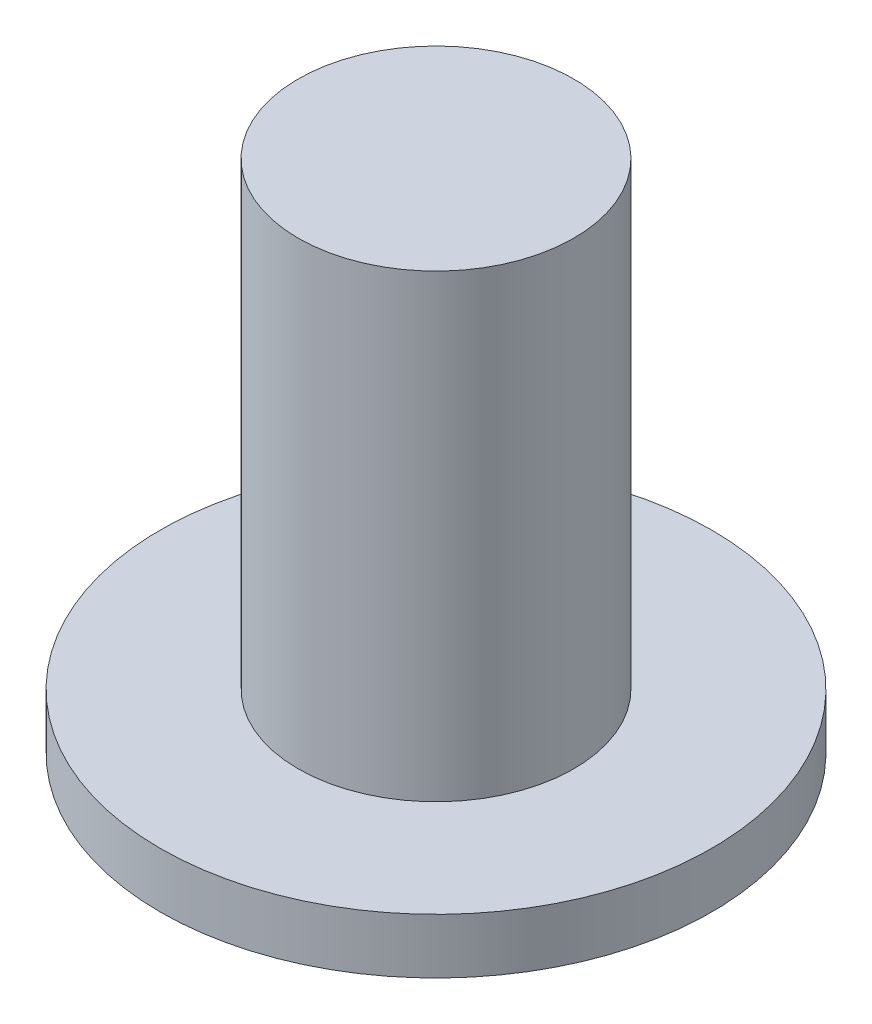
ISO-10303-21;
HEADER;
FILE_DESCRIPTION(('STEP AP214'),'2;1');
FILE_NAME('part.step','',(''),(''),'','','');
FILE_SCHEMA(('AUTOMOTIVE_DESIGN { 1 0 10303 214 1 1 1 1 }'));
ENDSEC;
DATA;
#1=APPLICATION_CONTEXT('core data for automotive mechanical design processes');
#2=APPLICATION_PROTOCOL_DEFINITION('international standard','automotive_design',2000,#1);
#3=PRODUCT_CONTEXT('',#1,'mechanical');
#4=PRODUCT('Part','Part','',(#3));
#5=PRODUCT_RELATED_PRODUCT_CATEGORY('part','',(#4));
#6=PRODUCT_DEFINITION_FORMATION('','',#4);
#7=PRODUCT_DEFINITION_CONTEXT('part definition',#1,'design');
#8=PRODUCT_DEFINITION('design','',#6,#7);
#9=PRODUCT_DEFINITION_SHAPE('','',#8);
#10=(LENGTH_UNIT() NAMED_UNIT(*) SI_UNIT(.MILLI.,.METRE.));
#11=(NAMED_UNIT(*) PLANE_ANGLE_UNIT() SI_UNIT($,.RADIAN.));
#12=(NAMED_UNIT(*) SI_UNIT($,.STERADIAN.) SOLID_ANGLE_UNIT());
#13=UNCERTAINTY_MEASURE_WITH_UNIT(LENGTH_MEASURE(1.E-05),#10,'distance_accuracy_value','');
#14=(GEOMETRIC_REPRESENTATION_CONTEXT(3) GLOBAL_UNCERTAINTY_ASSIGNED_CONTEXT((#13)) GLOBAL_UNIT_ASSIGNED_CONTEXT((#10,
#11,#12)) REPRESENTATION_CONTEXT('',''));
#15=CARTESIAN_POINT('',(0.,0.,0.));
#16=DIRECTION('',(0.,0.,1.));
#17=DIRECTION('',(1.,0.,0.));
#18=AXIS2_PLACEMENT_3D('',#15,#16,#17);
#19=CARTESIAN_POINT('',(0.,30.,0.));
#20=DIRECTION('',(0.,-1.,0.));
#21=DIRECTION('',(0.,0.,-1.));
#22=AXIS2_PLACEMENT_3D('',#19,#20,#21);
#23=CYLINDRICAL_SURFACE('',#22,150.);
#24=CARTESIAN_POINT('',(0.,30.,0.));
#25=DIRECTION('',(0.,1.,0.));
#26=DIRECTION('',(0.,0.,1.));
#27=AXIS2_PLACEMENT_3D('',#24,#25,#26);
#28=CIRCLE('',#27,150.);
#29=CARTESIAN_POINT('',(0.,30.,150.));
#30=VERTEX_POINT('',#29);
#31=EDGE_CURVE('E10',#30,#30,#28,.T.);
#32=ORIENTED_EDGE('',*,*,#31,.F.);
#33=EDGE_LOOP('',(#32));
#34=FACE_BOUND('',#33,.T.);
#35=CARTESIAN_POINT('',(0.,0.,0.));
#36=DIRECTION('',(0.,1.,0.));
#37=DIRECTION('',(0.,0.,1.));
#38=AXIS2_PLACEMENT_3D('',#35,#36,#37);
#39=CIRCLE('',#38,150.);
#40=CARTESIAN_POINT('',(0.,0.,150.));
#41=VERTEX_POINT('',#40);
#42=EDGE_CURVE('E34',#41,#41,#39,.T.);
#43=ORIENTED_EDGE('',*,*,#42,.T.);
#44=EDGE_LOOP('',(#43));
#45=FACE_BOUND('',#44,.T.);
#46=ADVANCED_FACE('F31',(#34,#45),#23,.T.);
#47=CARTESIAN_POINT('',(0.,30.,0.));
#48=DIRECTION('',(0.,1.,0.));
#49=DIRECTION('',(0.,0.,1.));
#50=AXIS2_PLACEMENT_3D('',#47,#48,#49);
#51=PLANE('',#50);
#52=CARTESIAN_POINT('',(0.,30.,0.));
#53=DIRECTION('',(0.,1.,0.));
#54=DIRECTION('',(0.,0.,1.));
#55=AXIS2_PLACEMENT_3D('',#52,#53,#54);
#56=CIRCLE('',#55,75.);
#57=CARTESIAN_POINT('',(0.,30.,75.));
#58=VERTEX_POINT('',#57);
#59=EDGE_CURVE('E43',#58,#58,#56,.T.);
#60=ORIENTED_EDGE('',*,*,#59,.F.);
#61=EDGE_LOOP('',(#60));
#62=FACE_BOUND('',#61,.T.);
#63=ORIENTED_EDGE('',*,*,#31,.T.);
#64=EDGE_LOOP('',(#63));
#65=FACE_BOUND('',#64,.T.);
#66=ADVANCED_FACE('F58',(#62,#65),#51,.T.);
#67=CARTESIAN_POINT('',(0.,0.,0.));
#68=DIRECTION('',(0.,1.,0.));
#69=DIRECTION('',(0.,0.,1.));
#70=AXIS2_PLACEMENT_3D('',#67,#68,#69);
#71=PLANE('',#70);
#72=ORIENTED_EDGE('',*,*,#42,.F.);
#73=EDGE_LOOP('',(#72));
#74=FACE_BOUND('',#73,.T.);
#75=ADVANCED_FACE('F54',(#74),#71,.F.);
#76=CARTESIAN_POINT('',(0.,280.,0.));
#77=DIRECTION('',(0.,-1.,0.));
#78=DIRECTION('',(0.,0.,-1.));
#79=AXIS2_PLACEMENT_3D('',#76,#77,#78);
#80=CYLINDRICAL_SURFACE('',#79,75.);
#81=CARTESIAN_POINT('',(0.,280.,0.));
#82=DIRECTION('',(0.,1.,0.));
#83=DIRECTION('',(0.,0.,1.));
#84=AXIS2_PLACEMENT_3D('',#81,#82,#83);
#85=CIRCLE('',#84,75.);
#86=CARTESIAN_POINT('',(0.,280.,75.));
#87=VERTEX_POINT('',#86);
#88=EDGE_CURVE('E41',#87,#87,#85,.T.);
#89=ORIENTED_EDGE('',*,*,#88,.F.);
#90=EDGE_LOOP('',(#89));
#91=FACE_BOUND('',#90,.T.);
#92=ORIENTED_EDGE('',*,*,#59,.T.);
#93=EDGE_LOOP('',(#92));
#94=FACE_BOUND('',#93,.T.);
#95=ADVANCED_FACE('F51',(#91,#94),#80,.T.);
#96=CARTESIAN_POINT('',(0.,280.,0.));
#97=DIRECTION('',(0.,1.,0.));
#98=DIRECTION('',(0.,0.,1.));
#99=AXIS2_PLACEMENT_3D('',#96,#97,#98);
#100=PLANE('',#99);
#101=ORIENTED_EDGE('',*,*,#88,.T.);
#102=EDGE_LOOP('',(#101));
#103=FACE_BOUND('',#102,.T.);
#104=ADVANCED_FACE('F49',(#103),#100,.T.);
#105=CLOSED_SHELL('',(#46,#66,#75,#95,#104));
#106=MANIFOLD_SOLID_BREP('B2',#105);
#107=ADVANCED_BREP_SHAPE_REPRESENTATION('',(#18,#106),#14);
#108=SHAPE_DEFINITION_REPRESENTATION(#9,#107);
ENDSEC;
END-ISO-10303-21;
